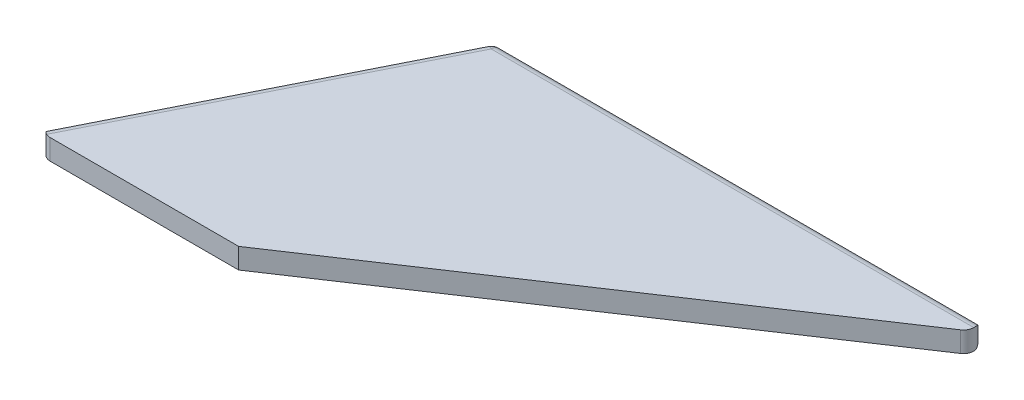
ISO-10303-21;
HEADER;
FILE_DESCRIPTION(('STEP AP214'),'2;1');
FILE_NAME('part.step','',(''),(''),'','','');
FILE_SCHEMA(('AUTOMOTIVE_DESIGN { 1 0 10303 214 1 1 1 1 }'));
ENDSEC;
DATA;
#1=APPLICATION_CONTEXT('core data for automotive mechanical design processes');
#2=APPLICATION_PROTOCOL_DEFINITION('international standard','automotive_design',2000,#1);
#3=PRODUCT_CONTEXT('',#1,'mechanical');
#4=PRODUCT('Part','Part','',(#3));
#5=PRODUCT_RELATED_PRODUCT_CATEGORY('part','',(#4));
#6=PRODUCT_DEFINITION_FORMATION('','',#4);
#7=PRODUCT_DEFINITION_CONTEXT('part definition',#1,'design');
#8=PRODUCT_DEFINITION('design','',#6,#7);
#9=PRODUCT_DEFINITION_SHAPE('','',#8);
#10=(LENGTH_UNIT() NAMED_UNIT(*) SI_UNIT(.MILLI.,.METRE.));
#11=(NAMED_UNIT(*) PLANE_ANGLE_UNIT() SI_UNIT($,.RADIAN.));
#12=(NAMED_UNIT(*) SI_UNIT($,.STERADIAN.) SOLID_ANGLE_UNIT());
#13=UNCERTAINTY_MEASURE_WITH_UNIT(LENGTH_MEASURE(1.E-05),#10,'distance_accuracy_value','');
#14=(GEOMETRIC_REPRESENTATION_CONTEXT(3) GLOBAL_UNCERTAINTY_ASSIGNED_CONTEXT((#13)) GLOBAL_UNIT_ASSIGNED_CONTEXT((#10,
#11,#12)) REPRESENTATION_CONTEXT('',''));
#15=CARTESIAN_POINT('',(0.,0.,0.));
#16=DIRECTION('',(0.,0.,1.));
#17=DIRECTION('',(1.,0.,0.));
#18=AXIS2_PLACEMENT_3D('',#15,#16,#17);
#19=CARTESIAN_POINT('',(45.0228809323155,2.,-30.));
#20=DIRECTION('',(-0.554504987252542,0.,-0.832180400581544));
#21=DIRECTION('',(-0.832180400581544,0.,0.554504987252542));
#22=AXIS2_PLACEMENT_3D('',#19,#20,#21);
#23=PLANE('',#22);
#24=DIRECTION('',(0.832180400581544,0.,-0.554504987252542));
#25=VECTOR('',#24,1.);
#26=CARTESIAN_POINT('',(45.0228809323155,0.,-30.));
#27=LINE('',#26,#25);
#28=CARTESIAN_POINT('',(0.,0.,0.));
#29=VERTEX_POINT('',#28);
#30=CARTESIAN_POINT('',(42.2732129315853,0.,-28.1678195994185));
#31=VERTEX_POINT('',#30);
#32=EDGE_CURVE('E138',#29,#31,#27,.T.);
#33=ORIENTED_EDGE('',*,*,#32,.T.);
#34=DIRECTION('',(0.,-1.,0.));
#35=VECTOR('',#34,1.);
#36=CARTESIAN_POINT('',(42.2732129315853,2.,-28.1678195994185));
#37=LINE('',#36,#35);
#38=CARTESIAN_POINT('',(42.2732129315853,2.,-28.1678195994185));
#39=VERTEX_POINT('',#38);
#40=EDGE_CURVE('E131',#31,#39,#37,.F.);
#41=ORIENTED_EDGE('',*,*,#40,.T.);
#42=DIRECTION('',(0.832180400581544,0.,-0.554504987252542));
#43=VECTOR('',#42,1.);
#44=CARTESIAN_POINT('',(45.0228809323155,2.,-30.));
#45=LINE('',#44,#43);
#46=CARTESIAN_POINT('',(0.,2.,0.));
#47=VERTEX_POINT('',#46);
#48=EDGE_CURVE('E201',#47,#39,#45,.T.);
#49=ORIENTED_EDGE('',*,*,#48,.F.);
#50=DIRECTION('',(0.,-1.,0.));
#51=VECTOR('',#50,1.);
#52=CARTESIAN_POINT('',(0.,2.,0.));
#53=LINE('',#52,#51);
#54=EDGE_CURVE('E196',#47,#29,#53,.T.);
#55=ORIENTED_EDGE('',*,*,#54,.T.);
#56=EDGE_LOOP('',(#33,#41,#49,#55));
#57=FACE_BOUND('',#56,.T.);
#58=ADVANCED_FACE('F45',(#57),#23,.F.);
#59=CARTESIAN_POINT('',(0.,2.,0.));
#60=DIRECTION('',(0.,0.,-1.));
#61=DIRECTION('',(-1.,0.,0.));
#62=AXIS2_PLACEMENT_3D('',#59,#60,#61);
#63=PLANE('',#62);
#64=DIRECTION('',(1.,0.,0.));
#65=VECTOR('',#64,1.);
#66=CARTESIAN_POINT('',(0.,2.,0.));
#67=LINE('',#66,#65);
#68=CARTESIAN_POINT('',(-18.3808620166513,2.,0.));
#69=VERTEX_POINT('',#68);
#70=EDGE_CURVE('E199',#69,#47,#67,.T.);
#71=ORIENTED_EDGE('',*,*,#70,.F.);
#72=DIRECTION('',(0.,-1.,0.));
#73=VECTOR('',#72,1.);
#74=CARTESIAN_POINT('',(-18.3808620166513,2.,0.));
#75=LINE('',#74,#73);
#76=CARTESIAN_POINT('',(-18.3808620166513,0.,0.));
#77=VERTEX_POINT('',#76);
#78=EDGE_CURVE('E11',#69,#77,#75,.T.);
#79=ORIENTED_EDGE('',*,*,#78,.T.);
#80=DIRECTION('',(1.,0.,0.));
#81=VECTOR('',#80,1.);
#82=CARTESIAN_POINT('',(0.,0.,0.));
#83=LINE('',#82,#81);
#84=EDGE_CURVE('E95',#77,#29,#83,.T.);
#85=ORIENTED_EDGE('',*,*,#84,.T.);
#86=ORIENTED_EDGE('',*,*,#54,.F.);
#87=EDGE_LOOP('',(#71,#79,#85,#86));
#88=FACE_BOUND('',#87,.T.);
#89=ADVANCED_FACE('F231',(#88),#63,.F.);
#90=CARTESIAN_POINT('',(0.,2.,0.));
#91=DIRECTION('',(0.,-1.,0.));
#92=DIRECTION('',(0.,0.,-1.));
#93=AXIS2_PLACEMENT_3D('',#90,#91,#92);
#94=PLANE('',#93);
#95=ORIENTED_EDGE('',*,*,#48,.T.);
#96=CARTESIAN_POINT('',(41.7187079443328,2.,-29.));
#97=DIRECTION('',(0.,-1.,0.));
#98=DIRECTION('',(0.,0.,-1.));
#99=AXIS2_PLACEMENT_3D('',#96,#97,#98);
#100=CIRCLE('',#99,1.);
#101=CARTESIAN_POINT('',(42.7187079443328,2.,-29.));
#102=VERTEX_POINT('',#101);
#103=EDGE_CURVE('E56',#39,#102,#100,.F.);
#104=ORIENTED_EDGE('',*,*,#103,.T.);
#105=DIRECTION('',(-1.,0.,0.));
#106=VECTOR('',#105,1.);
#107=CARTESIAN_POINT('',(0.,2.,-29.));
#108=LINE('',#107,#106);
#109=CARTESIAN_POINT('',(-4.35950647982353,2.,-29.));
#110=VERTEX_POINT('',#109);
#111=EDGE_CURVE('E124',#102,#110,#108,.T.);
#112=ORIENTED_EDGE('',*,*,#111,.T.);
#113=DIRECTION('',(-0.447759087838774,0.,0.894154236839366));
#114=VECTOR('',#113,1.);
#115=CARTESIAN_POINT('',(-15.0960817483164,2.,-7.55955462164862));
#116=LINE('',#115,#114);
#117=CARTESIAN_POINT('',(-18.8286211044901,2.,-0.105845763160635));
#118=VERTEX_POINT('',#117);
#119=EDGE_CURVE('E120',#110,#118,#116,.T.);
#120=ORIENTED_EDGE('',*,*,#119,.T.);
#121=CARTESIAN_POINT('',(-18.3808620166513,2.,-1.));
#122=DIRECTION('',(0.,-1.,0.));
#123=DIRECTION('',(0.,0.,-1.));
#124=AXIS2_PLACEMENT_3D('',#121,#122,#123);
#125=CIRCLE('',#124,1.);
#126=EDGE_CURVE('E122',#118,#69,#125,.F.);
#127=ORIENTED_EDGE('',*,*,#126,.T.);
#128=ORIENTED_EDGE('',*,*,#70,.T.);
#129=EDGE_LOOP('',(#95,#104,#112,#120,#127,#128));
#130=FACE_BOUND('',#129,.T.);
#131=ADVANCED_FACE('F121',(#130),#94,.F.);
#132=CARTESIAN_POINT('',(0.,0.,0.));
#133=DIRECTION('',(0.,-1.,0.));
#134=DIRECTION('',(0.,0.,-1.));
#135=AXIS2_PLACEMENT_3D('',#132,#133,#134);
#136=PLANE('',#135);
#137=DIRECTION('',(-1.,0.,0.));
#138=VECTOR('',#137,1.);
#139=CARTESIAN_POINT('',(45.0228809323155,0.,-29.));
#140=LINE('',#139,#138);
#141=CARTESIAN_POINT('',(-4.35950647982353,0.,-29.));
#142=VERTEX_POINT('',#141);
#143=CARTESIAN_POINT('',(42.7187079443328,0.,-29.));
#144=VERTEX_POINT('',#143);
#145=EDGE_CURVE('E187',#142,#144,#140,.F.);
#146=ORIENTED_EDGE('',*,*,#145,.T.);
#147=CARTESIAN_POINT('',(41.7187079443328,0.,-29.));
#148=DIRECTION('',(0.,-1.,0.));
#149=DIRECTION('',(0.,0.,-1.));
#150=AXIS2_PLACEMENT_3D('',#147,#148,#149);
#151=CIRCLE('',#150,1.);
#152=EDGE_CURVE('E184',#144,#31,#151,.T.);
#153=ORIENTED_EDGE('',*,*,#152,.T.);
#154=ORIENTED_EDGE('',*,*,#32,.F.);
#155=ORIENTED_EDGE('',*,*,#84,.F.);
#156=CARTESIAN_POINT('',(-18.3808620166513,0.,-1.));
#157=DIRECTION('',(0.,-1.,0.));
#158=DIRECTION('',(0.,0.,-1.));
#159=AXIS2_PLACEMENT_3D('',#156,#157,#158);
#160=CIRCLE('',#159,1.);
#161=CARTESIAN_POINT('',(-18.8286211044901,0.,-0.105845763160636));
#162=VERTEX_POINT('',#161);
#163=EDGE_CURVE('E190',#77,#162,#160,.T.);
#164=ORIENTED_EDGE('',*,*,#163,.T.);
#165=DIRECTION('',(-0.447759087838774,0.,0.894154236839366));
#166=VECTOR('',#165,1.);
#167=CARTESIAN_POINT('',(-4.08296483084515,0.,-29.5522409121612));
#168=LINE('',#167,#166);
#169=EDGE_CURVE('E193',#162,#142,#168,.F.);
#170=ORIENTED_EDGE('',*,*,#169,.T.);
#171=EDGE_LOOP('',(#146,#153,#154,#155,#164,#170));
#172=FACE_BOUND('',#171,.T.);
#173=ADVANCED_FACE('F290',(#172),#136,.T.);
#174=CARTESIAN_POINT('',(-18.3808620166513,2.,-1.));
#175=DIRECTION('',(0.,-1.,0.));
#176=DIRECTION('',(0.,0.,-1.));
#177=AXIS2_PLACEMENT_3D('',#174,#175,#176);
#178=CYLINDRICAL_SURFACE('',#177,1.);
#179=ORIENTED_EDGE('',*,*,#78,.F.);
#180=ORIENTED_EDGE('',*,*,#126,.F.);
#181=CARTESIAN_POINT('',(-18.3808620166513,1.,-1.));
#182=DIRECTION('',(-0.3166134873487,-0.707106781186547,0.632262524295798));
#183=DIRECTION('',(0.3166134873487,-0.707106781186547,-0.632262524295798));
#184=AXIS2_PLACEMENT_3D('',#181,#182,#183);
#185=ELLIPSE('',#184,1.41421356237309,1.);
#186=CARTESIAN_POINT('',(-19.2750162534907,1.,-1.44775908783877));
#187=VERTEX_POINT('',#186);
#188=EDGE_CURVE('E49',#187,#118,#185,.F.);
#189=ORIENTED_EDGE('',*,*,#188,.F.);
#190=CARTESIAN_POINT('',(-18.3808620166513,1.,-1.));
#191=DIRECTION('',(0.3166134873487,-0.707106781186547,-0.632262524295798));
#192=DIRECTION('',(0.3166134873487,0.707106781186547,-0.632262524295798));
#193=AXIS2_PLACEMENT_3D('',#190,#191,#192);
#194=ELLIPSE('',#193,1.41421356237309,1.);
#195=EDGE_CURVE('E143',#162,#187,#194,.T.);
#196=ORIENTED_EDGE('',*,*,#195,.F.);
#197=ORIENTED_EDGE('',*,*,#163,.F.);
#198=EDGE_LOOP('',(#179,#180,#189,#196,#197));
#199=FACE_BOUND('',#198,.T.);
#200=ADVANCED_FACE('F47',(#199),#178,.T.);
#201=CARTESIAN_POINT('',(-15.0960817483164,1.,-7.55955462164862));
#202=DIRECTION('',(-0.447759087838774,0.,0.894154236839366));
#203=DIRECTION('',(0.894154236839366,0.,0.447759087838774));
#204=AXIS2_PLACEMENT_3D('',#201,#202,#203);
#205=CYLINDRICAL_SURFACE('',#204,1.);
#206=CARTESIAN_POINT('',(-4.35950647982353,1.,-29.));
#207=DIRECTION('',(0.447759087838773,0.,-0.894154236839366));
#208=DIRECTION('',(-0.894154236839366,0.,-0.447759087838774));
#209=AXIS2_PLACEMENT_3D('',#206,#207,#208);
#210=CIRCLE('',#209,1.);
#211=CARTESIAN_POINT('',(-5.25366071666289,1.,-29.4477590878388));
#212=VERTEX_POINT('',#211);
#213=EDGE_CURVE('E148',#212,#110,#210,.T.);
#214=ORIENTED_EDGE('',*,*,#213,.F.);
#215=DIRECTION('',(-0.447759087838774,0.,0.894154236839366));
#216=VECTOR('',#215,1.);
#217=CARTESIAN_POINT('',(-20.,1.,0.));
#218=LINE('',#217,#216);
#219=EDGE_CURVE('E135',#187,#212,#218,.F.);
#220=ORIENTED_EDGE('',*,*,#219,.F.);
#221=ORIENTED_EDGE('',*,*,#188,.T.);
#222=ORIENTED_EDGE('',*,*,#119,.F.);
#223=EDGE_LOOP('',(#214,#220,#221,#222));
#224=FACE_BOUND('',#223,.T.);
#225=ADVANCED_FACE('F133',(#224),#205,.T.);
#226=CARTESIAN_POINT('',(-19.1058457631606,1.,0.447759087838774));
#227=DIRECTION('',(0.447759087838774,0.,-0.894154236839366));
#228=DIRECTION('',(-0.894154236839366,0.,-0.447759087838774));
#229=AXIS2_PLACEMENT_3D('',#226,#227,#228);
#230=CYLINDRICAL_SURFACE('',#229,1.);
#231=ORIENTED_EDGE('',*,*,#195,.T.);
#232=ORIENTED_EDGE('',*,*,#219,.T.);
#233=CARTESIAN_POINT('',(-4.35950647982353,1.,-29.));
#234=DIRECTION('',(0.447759087838774,0.,-0.894154236839366));
#235=DIRECTION('',(-0.894154236839366,0.,-0.447759087838775));
#236=AXIS2_PLACEMENT_3D('',#233,#234,#235);
#237=CIRCLE('',#236,1.);
#238=EDGE_CURVE('E155',#142,#212,#237,.T.);
#239=ORIENTED_EDGE('',*,*,#238,.F.);
#240=ORIENTED_EDGE('',*,*,#169,.F.);
#241=EDGE_LOOP('',(#231,#232,#239,#240));
#242=FACE_BOUND('',#241,.T.);
#243=ADVANCED_FACE('F221',(#242),#230,.T.);
#244=CARTESIAN_POINT('',(-4.35950647982353,1.,-29.));
#245=DIRECTION('',(0.,1.,0.));
#246=DIRECTION('',(-1.,0.,0.));
#247=AXIS2_PLACEMENT_3D('',#244,#245,#246);
#248=SPHERICAL_SURFACE('',#247,1.);
#249=CARTESIAN_POINT('',(-4.35950647982353,1.,-29.));
#250=DIRECTION('',(0.,1.,0.));
#251=DIRECTION('',(0.,0.,1.));
#252=AXIS2_PLACEMENT_3D('',#249,#250,#251);
#253=CIRCLE('',#252,1.);
#254=CARTESIAN_POINT('',(-4.35950647982353,1.,-30.));
#255=VERTEX_POINT('',#254);
#256=EDGE_CURVE('E80',#255,#212,#253,.T.);
#257=ORIENTED_EDGE('',*,*,#256,.T.);
#258=ORIENTED_EDGE('',*,*,#213,.T.);
#259=CARTESIAN_POINT('',(-4.35950647982353,1.,-29.));
#260=DIRECTION('',(-1.,0.,0.));
#261=DIRECTION('',(0.,0.,1.));
#262=AXIS2_PLACEMENT_3D('',#259,#260,#261);
#263=CIRCLE('',#262,1.);
#264=EDGE_CURVE('E158',#255,#110,#263,.F.);
#265=ORIENTED_EDGE('',*,*,#264,.F.);
#266=EDGE_LOOP('',(#257,#258,#265));
#267=FACE_BOUND('',#266,.T.);
#268=ADVANCED_FACE('F218',(#267),#248,.T.);
#269=CARTESIAN_POINT('',(-4.35950647982353,1.,-29.));
#270=DIRECTION('',(0.,-1.,0.));
#271=DIRECTION('',(1.,0.,0.));
#272=AXIS2_PLACEMENT_3D('',#269,#270,#271);
#273=SPHERICAL_SURFACE('',#272,1.);
#274=ORIENTED_EDGE('',*,*,#238,.T.);
#275=ORIENTED_EDGE('',*,*,#256,.F.);
#276=CARTESIAN_POINT('',(-4.35950647982353,1.,-29.));
#277=DIRECTION('',(-1.,0.,0.));
#278=DIRECTION('',(0.,-1.,0.));
#279=AXIS2_PLACEMENT_3D('',#276,#277,#278);
#280=CIRCLE('',#279,1.);
#281=EDGE_CURVE('E165',#142,#255,#280,.F.);
#282=ORIENTED_EDGE('',*,*,#281,.F.);
#283=EDGE_LOOP('',(#274,#275,#282));
#284=FACE_BOUND('',#283,.T.);
#285=ADVANCED_FACE('F220',(#284),#273,.T.);
#286=CARTESIAN_POINT('',(0.,1.,-29.));
#287=DIRECTION('',(-1.,0.,0.));
#288=DIRECTION('',(0.,0.,1.));
#289=AXIS2_PLACEMENT_3D('',#286,#287,#288);
#290=CYLINDRICAL_SURFACE('',#289,1.);
#291=DIRECTION('',(-1.,0.,0.));
#292=VECTOR('',#291,1.);
#293=CARTESIAN_POINT('',(-4.97711906768451,1.,-30.));
#294=LINE('',#293,#292);
#295=CARTESIAN_POINT('',(41.7187079443328,1.,-30.));
#296=VERTEX_POINT('',#295);
#297=EDGE_CURVE('E162',#255,#296,#294,.F.);
#298=ORIENTED_EDGE('',*,*,#297,.F.);
#299=ORIENTED_EDGE('',*,*,#264,.T.);
#300=ORIENTED_EDGE('',*,*,#111,.F.);
#301=CARTESIAN_POINT('',(41.7187079443328,1.,-29.));
#302=DIRECTION('',(-0.707106781186547,0.707106781186547,0.));
#303=DIRECTION('',(-0.707106781186547,-0.707106781186547,0.));
#304=AXIS2_PLACEMENT_3D('',#301,#302,#303);
#305=ELLIPSE('',#304,1.41421356237309,1.);
#306=EDGE_CURVE('E169',#296,#102,#305,.F.);
#307=ORIENTED_EDGE('',*,*,#306,.F.);
#308=EDGE_LOOP('',(#298,#299,#300,#307));
#309=FACE_BOUND('',#308,.T.);
#310=ADVANCED_FACE('F217',(#309),#290,.T.);
#311=CARTESIAN_POINT('',(-4.97711906768451,1.,-29.));
#312=DIRECTION('',(1.,0.,0.));
#313=DIRECTION('',(0.,0.,-1.));
#314=AXIS2_PLACEMENT_3D('',#311,#312,#313);
#315=CYLINDRICAL_SURFACE('',#314,1.);
#316=ORIENTED_EDGE('',*,*,#281,.T.);
#317=ORIENTED_EDGE('',*,*,#297,.T.);
#318=CARTESIAN_POINT('',(41.7187079443328,1.,-29.));
#319=DIRECTION('',(0.707106781186547,0.707106781186547,0.));
#320=DIRECTION('',(0.707106781186547,-0.707106781186547,0.));
#321=AXIS2_PLACEMENT_3D('',#318,#319,#320);
#322=ELLIPSE('',#321,1.41421356237309,1.);
#323=EDGE_CURVE('E173',#144,#296,#322,.T.);
#324=ORIENTED_EDGE('',*,*,#323,.F.);
#325=ORIENTED_EDGE('',*,*,#145,.F.);
#326=EDGE_LOOP('',(#316,#317,#324,#325));
#327=FACE_BOUND('',#326,.T.);
#328=ADVANCED_FACE('F241',(#327),#315,.T.);
#329=CARTESIAN_POINT('',(41.7187079443328,2.,-29.));
#330=DIRECTION('',(0.,-1.,0.));
#331=DIRECTION('',(0.,0.,-1.));
#332=AXIS2_PLACEMENT_3D('',#329,#330,#331);
#333=CYLINDRICAL_SURFACE('',#332,1.);
#334=ORIENTED_EDGE('',*,*,#103,.F.);
#335=ORIENTED_EDGE('',*,*,#40,.F.);
#336=ORIENTED_EDGE('',*,*,#152,.F.);
#337=ORIENTED_EDGE('',*,*,#323,.T.);
#338=ORIENTED_EDGE('',*,*,#306,.T.);
#339=EDGE_LOOP('',(#334,#335,#336,#337,#338));
#340=FACE_BOUND('',#339,.T.);
#341=ADVANCED_FACE('F212',(#340),#333,.T.);
#342=CLOSED_SHELL('',(#58,#89,#131,#173,#200,#225,#243,#268,#285,#310,#328,#341));
#343=MANIFOLD_SOLID_BREP('B2',#342);
#344=ADVANCED_BREP_SHAPE_REPRESENTATION('',(#18,#343),#14);
#345=SHAPE_DEFINITION_REPRESENTATION(#9,#344);
ENDSEC;
END-ISO-10303-21;
